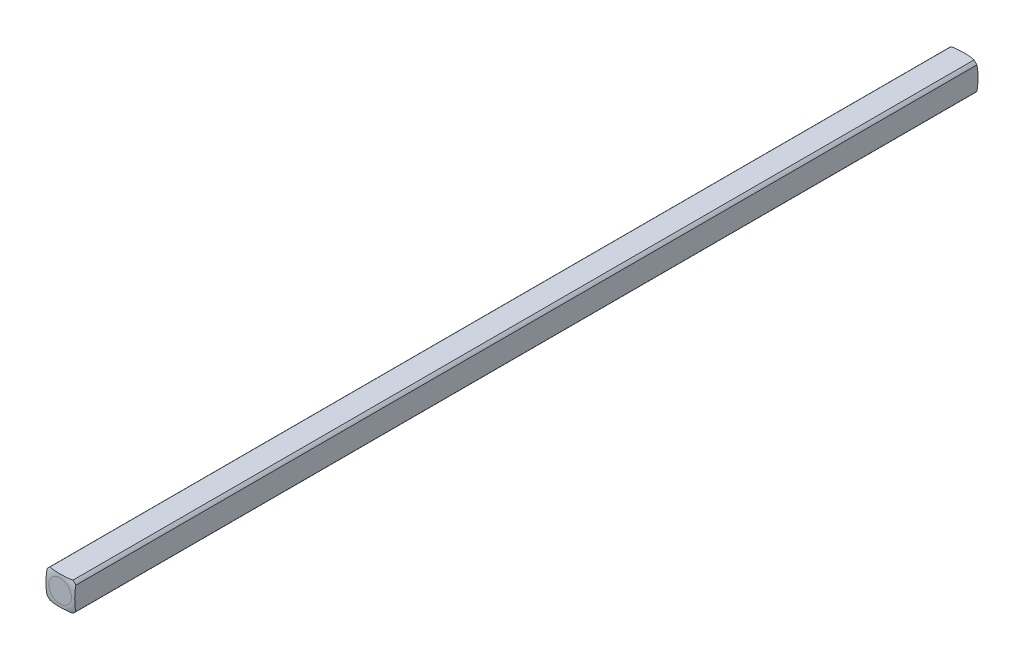
ISO-10303-21;
HEADER;
FILE_DESCRIPTION(('STEP AP214'),'2;1');
FILE_NAME('part.step','',(''),(''),'','','');
FILE_SCHEMA(('AUTOMOTIVE_DESIGN { 1 0 10303 214 1 1 1 1 }'));
ENDSEC;
DATA;
#1=APPLICATION_CONTEXT('core data for automotive mechanical design processes');
#2=APPLICATION_PROTOCOL_DEFINITION('international standard','automotive_design',2000,#1);
#3=PRODUCT_CONTEXT('',#1,'mechanical');
#4=PRODUCT('Part','Part','',(#3));
#5=PRODUCT_RELATED_PRODUCT_CATEGORY('part','',(#4));
#6=PRODUCT_DEFINITION_FORMATION('','',#4);
#7=PRODUCT_DEFINITION_CONTEXT('part definition',#1,'design');
#8=PRODUCT_DEFINITION('design','',#6,#7);
#9=PRODUCT_DEFINITION_SHAPE('','',#8);
#10=(LENGTH_UNIT() NAMED_UNIT(*) SI_UNIT(.MILLI.,.METRE.));
#11=(NAMED_UNIT(*) PLANE_ANGLE_UNIT() SI_UNIT($,.RADIAN.));
#12=(NAMED_UNIT(*) SI_UNIT($,.STERADIAN.) SOLID_ANGLE_UNIT());
#13=UNCERTAINTY_MEASURE_WITH_UNIT(LENGTH_MEASURE(1.E-05),#10,'distance_accuracy_value','');
#14=(GEOMETRIC_REPRESENTATION_CONTEXT(3) GLOBAL_UNCERTAINTY_ASSIGNED_CONTEXT((#13)) GLOBAL_UNIT_ASSIGNED_CONTEXT((#10,
#11,#12)) REPRESENTATION_CONTEXT('',''));
#15=CARTESIAN_POINT('',(0.,0.,0.));
#16=DIRECTION('',(0.,0.,1.));
#17=DIRECTION('',(1.,0.,0.));
#18=AXIS2_PLACEMENT_3D('',#15,#16,#17);
#19=CARTESIAN_POINT('',(-1.5875,-1.5875,49.911));
#20=DIRECTION('',(0.,1.,0.));
#21=DIRECTION('',(0.,0.,1.));
#22=AXIS2_PLACEMENT_3D('',#19,#20,#21);
#23=PLANE('',#22);
#24=CARTESIAN_POINT('',(1.26841150657032,-1.5875,-49.759919142098));
#25=CARTESIAN_POINT('',(1.22720105040827,-1.5875,-49.7701762604742));
#26=CARTESIAN_POINT('',(1.18578761357715,-1.5875,-49.7795927535058));
#27=CARTESIAN_POINT('',(1.10271120238514,-1.5875,-49.796861071626));
#28=CARTESIAN_POINT('',(1.06104879805324,-1.5875,-49.8047156312752));
#29=CARTESIAN_POINT('',(0.977511179219644,-1.5875,-49.8190074369776));
#30=CARTESIAN_POINT('',(0.935636116351978,-1.5875,-49.82544557827));
#31=CARTESIAN_POINT('',(0.85195632596747,-1.5875,-49.8370202217379));
#32=CARTESIAN_POINT('',(0.810152608329594,-1.5875,-49.8421640837943));
#33=CARTESIAN_POINT('',(0.726405135779092,-1.5875,-49.8513448983346));
#34=CARTESIAN_POINT('',(0.684461324130969,-1.5875,-49.8553813277516));
#35=CARTESIAN_POINT('',(0.600471089740472,-1.5875,-49.8624873965405));
#36=CARTESIAN_POINT('',(0.55842462478368,-1.5875,-49.8655565288188));
#37=CARTESIAN_POINT('',(0.442316252980614,-1.5875,-49.872876819996));
#38=CARTESIAN_POINT('',(0.368199297688235,-1.5875,-49.8762546095867));
#39=CARTESIAN_POINT('',(0.219899169562756,-1.5875,-49.8810241426145));
#40=CARTESIAN_POINT('',(0.145715990031034,-1.5875,-49.8824156550284));
#41=CARTESIAN_POINT('',(-0.00261925426802457,-1.5875,-49.8835115381934));
#42=CARTESIAN_POINT('',(-0.0767713119995583,-1.5875,-49.8832168909072));
#43=CARTESIAN_POINT('',(-0.225055834270109,-1.5875,-49.8808755268396));
#44=CARTESIAN_POINT('',(-0.299188296702211,-1.5875,-49.8788286662978));
#45=CARTESIAN_POINT('',(-0.448491393859349,-1.5875,-49.872519272075));
#46=CARTESIAN_POINT('',(-0.523660700911162,-1.5875,-49.8682235679572));
#47=CARTESIAN_POINT('',(-0.673772419103431,-1.5875,-49.8567011997426));
#48=CARTESIAN_POINT('',(-0.748714874122628,-1.5875,-49.8494751445196));
#49=CARTESIAN_POINT('',(-0.873294781040693,-1.5875,-49.8343054206116));
#50=CARTESIAN_POINT('',(-0.923058303404124,-1.5875,-49.8273998036191));
#51=CARTESIAN_POINT('',(-1.02230885751262,-1.5875,-49.8116736221696));
#52=CARTESIAN_POINT('',(-1.07179576173138,-1.5875,-49.8028522389467));
#53=CARTESIAN_POINT('',(-1.17042027552899,-1.5875,-49.7830571345187));
#54=CARTESIAN_POINT('',(-1.21955717475179,-1.58749999999998,-49.772079888906));
#55=CARTESIAN_POINT('',(-1.26841150657033,-1.58749999999996,-49.759919142098));
#56=B_SPLINE_CURVE_WITH_KNOTS('',3,(#24,#25,#26,#27,#28,#29,#30,#31,#32,#33,#34,#35,#36,#37,#38,
#39,#40,#41,#42,#43,#44,#45,#46,#47,#48,#49,#50,#51,#52,#53,#54,#55),.UNSPECIFIED.,.F.,.F.,(4,2,
2,2,2,2,2,2,2,2,2,2,2,2,2,4),(0.,0.127385669214949,0.254546315061895,0.381626357369329,
0.507966543484096,0.634366300757393,0.760832211740227,0.983375124489411,1.20594391900471,
1.42838311012148,1.65084055299026,1.87667574497213,2.10246403651328,2.25315484465145,
2.40391018266841,2.55491405868559),.UNSPECIFIED.);
#57=CARTESIAN_POINT('',(1.26841150657032,-1.5875,-49.759919142098));
#58=VERTEX_POINT('',#57);
#59=CARTESIAN_POINT('',(-1.26841150657032,-1.5875,-49.759919142098));
#60=VERTEX_POINT('',#59);
#61=EDGE_CURVE('E112',#58,#60,#56,.T.);
#62=ORIENTED_EDGE('',*,*,#61,.F.);
#63=DIRECTION('',(0.,0.,1.));
#64=VECTOR('',#63,1.);
#65=CARTESIAN_POINT('',(1.26841150657032,-1.5875,-49.911));
#66=LINE('',#65,#64);
#67=CARTESIAN_POINT('',(1.26841150657032,-1.5875,49.759919142098));
#68=VERTEX_POINT('',#67);
#69=EDGE_CURVE('E122',#68,#58,#66,.F.);
#70=ORIENTED_EDGE('',*,*,#69,.F.);
#71=CARTESIAN_POINT('',(-1.26841150657033,-1.5875,49.759919142098));
#72=CARTESIAN_POINT('',(-1.22720105040827,-1.5875,49.7701762604742));
#73=CARTESIAN_POINT('',(-1.18578761357715,-1.5875,49.7795927535058));
#74=CARTESIAN_POINT('',(-1.10271120238514,-1.5875,49.796861071626));
#75=CARTESIAN_POINT('',(-1.06104879805324,-1.5875,49.8047156312752));
#76=CARTESIAN_POINT('',(-0.97751117921964,-1.5875,49.8190074369776));
#77=CARTESIAN_POINT('',(-0.935636116351973,-1.5875,49.82544557827));
#78=CARTESIAN_POINT('',(-0.851956325967463,-1.5875,49.8370202217379));
#79=CARTESIAN_POINT('',(-0.810152608329586,-1.5875,49.8421640837943));
#80=CARTESIAN_POINT('',(-0.726405135779083,-1.5875,49.8513448983346));
#81=CARTESIAN_POINT('',(-0.684461324130958,-1.5875,49.8553813277516));
#82=CARTESIAN_POINT('',(-0.60047108974046,-1.5875,49.8624873965405));
#83=CARTESIAN_POINT('',(-0.558424624783667,-1.5875,49.8655565288188));
#84=CARTESIAN_POINT('',(-0.4423162529806,-1.5875,49.872876819996));
#85=CARTESIAN_POINT('',(-0.368199297688222,-1.5875,49.8762546095867));
#86=CARTESIAN_POINT('',(-0.219899169562744,-1.5875,49.8810241426145));
#87=CARTESIAN_POINT('',(-0.145715990031022,-1.5875,49.8824156550284));
#88=CARTESIAN_POINT('',(0.00261925426803486,-1.5875,49.8835115381934));
#89=CARTESIAN_POINT('',(0.076771311999568,-1.5875,49.8832168909072));
#90=CARTESIAN_POINT('',(0.225055834270118,-1.5875,49.8808755268396));
#91=CARTESIAN_POINT('',(0.299188296702219,-1.5875,49.8788286662978));
#92=CARTESIAN_POINT('',(0.448491393859357,-1.5875,49.872519272075));
#93=CARTESIAN_POINT('',(0.523660700911169,-1.5875,49.8682235679572));
#94=CARTESIAN_POINT('',(0.673772419103438,-1.5875,49.8567011997426));
#95=CARTESIAN_POINT('',(0.748714874122636,-1.5875,49.8494751445196));
#96=CARTESIAN_POINT('',(0.8732947810407,-1.5875,49.8343054206116));
#97=CARTESIAN_POINT('',(0.92305830340413,-1.5875,49.8273998036191));
#98=CARTESIAN_POINT('',(1.02230885751263,-1.5875,49.8116736221696));
#99=CARTESIAN_POINT('',(1.07179576173138,-1.5875,49.8028522389467));
#100=CARTESIAN_POINT('',(1.17042027552899,-1.5875,49.7830571345187));
#101=CARTESIAN_POINT('',(1.2195571747518,-1.58749999999998,49.772079888906));
#102=CARTESIAN_POINT('',(1.26841150657033,-1.58749999999996,49.759919142098));
#103=B_SPLINE_CURVE_WITH_KNOTS('',3,(#71,#72,#73,#74,#75,#76,#77,#78,#79,#80,#81,#82,#83,#84,
#85,#86,#87,#88,#89,#90,#91,#92,#93,#94,#95,#96,#97,#98,#99,#100,#101,#102),.UNSPECIFIED.,.F.,
.F.,(4,2,2,2,2,2,2,2,2,2,2,2,2,2,2,4),(0.,0.127385669214952,0.2545463150619,0.381626357369337,
0.507966543484107,0.634366300757407,0.760832211740243,0.983375124489425,1.20594391900472,
1.42838311012149,1.65084055299027,1.87667574497214,2.10246403651329,2.25315484465146,
2.40391018266842,2.55491405868559),.UNSPECIFIED.);
#104=CARTESIAN_POINT('',(-1.26841150657033,-1.5875,49.759919142098));
#105=VERTEX_POINT('',#104);
#106=EDGE_CURVE('E87',#105,#68,#103,.T.);
#107=ORIENTED_EDGE('',*,*,#106,.F.);
#108=DIRECTION('',(0.,0.,1.));
#109=VECTOR('',#108,1.);
#110=CARTESIAN_POINT('',(-1.26841150657032,-1.5875,-49.911));
#111=LINE('',#110,#109);
#112=EDGE_CURVE('E111',#60,#105,#111,.T.);
#113=ORIENTED_EDGE('',*,*,#112,.F.);
#114=EDGE_LOOP('',(#62,#70,#107,#113));
#115=FACE_BOUND('',#114,.T.);
#116=ADVANCED_FACE('F16',(#115),#23,.F.);
#117=CARTESIAN_POINT('',(0.,0.,-49.911));
#118=DIRECTION('',(0.,0.,1.));
#119=DIRECTION('',(1.,0.,0.));
#120=AXIS2_PLACEMENT_3D('',#117,#118,#119);
#121=CYLINDRICAL_SURFACE('',#120,2.032);
#122=CARTESIAN_POINT('',(0.,0.,49.759919142098));
#123=DIRECTION('',(0.,0.,1.));
#124=DIRECTION('',(1.,0.,0.));
#125=AXIS2_PLACEMENT_3D('',#122,#123,#124);
#126=CIRCLE('',#125,2.032);
#127=CARTESIAN_POINT('',(-1.5875,-1.26841150657032,49.759919142098));
#128=VERTEX_POINT('',#127);
#129=EDGE_CURVE('E96',#105,#128,#126,.F.);
#130=ORIENTED_EDGE('',*,*,#129,.T.);
#131=DIRECTION('',(0.,0.,-1.));
#132=VECTOR('',#131,1.);
#133=CARTESIAN_POINT('',(-1.5875,-1.26841150657032,49.911));
#134=LINE('',#133,#132);
#135=CARTESIAN_POINT('',(-1.5875,-1.26841150657032,-49.759919142098));
#136=VERTEX_POINT('',#135);
#137=EDGE_CURVE('E109',#128,#136,#134,.T.);
#138=ORIENTED_EDGE('',*,*,#137,.T.);
#139=CARTESIAN_POINT('',(0.,0.,-49.759919142098));
#140=DIRECTION('',(0.,0.,1.));
#141=DIRECTION('',(1.,0.,0.));
#142=AXIS2_PLACEMENT_3D('',#139,#140,#141);
#143=CIRCLE('',#142,2.032);
#144=EDGE_CURVE('E279',#60,#136,#143,.F.);
#145=ORIENTED_EDGE('',*,*,#144,.F.);
#146=ORIENTED_EDGE('',*,*,#112,.T.);
#147=EDGE_LOOP('',(#130,#138,#145,#146));
#148=FACE_BOUND('',#147,.T.);
#149=ADVANCED_FACE('F107',(#148),#121,.T.);
#150=CARTESIAN_POINT('',(0.,0.,-49.911));
#151=DIRECTION('',(0.,0.,1.));
#152=DIRECTION('',(1.,0.,0.));
#153=AXIS2_PLACEMENT_3D('',#150,#151,#152);
#154=CYLINDRICAL_SURFACE('',#153,2.032);
#155=CARTESIAN_POINT('',(0.,0.,49.759919142098));
#156=DIRECTION('',(0.,0.,1.));
#157=DIRECTION('',(1.,0.,0.));
#158=AXIS2_PLACEMENT_3D('',#155,#156,#157);
#159=CIRCLE('',#158,2.032);
#160=CARTESIAN_POINT('',(1.5875,-1.26841150657032,49.759919142098));
#161=VERTEX_POINT('',#160);
#162=EDGE_CURVE('E278',#161,#68,#159,.F.);
#163=ORIENTED_EDGE('',*,*,#162,.T.);
#164=ORIENTED_EDGE('',*,*,#69,.T.);
#165=CARTESIAN_POINT('',(0.,0.,-49.759919142098));
#166=DIRECTION('',(0.,0.,1.));
#167=DIRECTION('',(1.,0.,0.));
#168=AXIS2_PLACEMENT_3D('',#165,#166,#167);
#169=CIRCLE('',#168,2.032);
#170=CARTESIAN_POINT('',(1.5875,-1.26841150657032,-49.759919142098));
#171=VERTEX_POINT('',#170);
#172=EDGE_CURVE('E167',#58,#171,#169,.T.);
#173=ORIENTED_EDGE('',*,*,#172,.T.);
#174=DIRECTION('',(0.,0.,1.));
#175=VECTOR('',#174,1.);
#176=CARTESIAN_POINT('',(1.5875,-1.26841150657032,49.911));
#177=LINE('',#176,#175);
#178=EDGE_CURVE('E189',#171,#161,#177,.T.);
#179=ORIENTED_EDGE('',*,*,#178,.T.);
#180=EDGE_LOOP('',(#163,#164,#173,#179));
#181=FACE_BOUND('',#180,.T.);
#182=ADVANCED_FACE('F149',(#181),#154,.T.);
#183=CARTESIAN_POINT('',(-1.5875,1.5875,49.911));
#184=DIRECTION('',(0.,0.,-1.));
#185=DIRECTION('',(-1.,0.,0.));
#186=AXIS2_PLACEMENT_3D('',#183,#184,#185);
#187=PLANE('',#186);
#188=CARTESIAN_POINT('',(0.,0.,49.911));
#189=DIRECTION('',(0.,0.,-1.));
#190=DIRECTION('',(1.,0.,0.));
#191=AXIS2_PLACEMENT_3D('',#188,#189,#190);
#192=CIRCLE('',#191,1.24506403026729);
#193=CARTESIAN_POINT('',(1.24506403026729,0.,49.911));
#194=VERTEX_POINT('',#193);
#195=CARTESIAN_POINT('',(-1.24506403026729,0.,49.911));
#196=VERTEX_POINT('',#195);
#197=EDGE_CURVE('E117',#194,#196,#192,.T.);
#198=ORIENTED_EDGE('',*,*,#197,.F.);
#199=CARTESIAN_POINT('',(0.,0.,49.911));
#200=DIRECTION('',(0.,0.,-1.));
#201=DIRECTION('',(-1.,0.,0.));
#202=AXIS2_PLACEMENT_3D('',#199,#200,#201);
#203=CIRCLE('',#202,1.24506403026729);
#204=EDGE_CURVE('E163',#196,#194,#203,.T.);
#205=ORIENTED_EDGE('',*,*,#204,.F.);
#206=EDGE_LOOP('',(#198,#205));
#207=FACE_BOUND('',#206,.T.);
#208=ADVANCED_FACE('F139',(#207),#187,.F.);
#209=CARTESIAN_POINT('',(-1.5875,-1.5875,49.911));
#210=DIRECTION('',(1.,0.,0.));
#211=DIRECTION('',(0.,0.,-1.));
#212=AXIS2_PLACEMENT_3D('',#209,#210,#211);
#213=PLANE('',#212);
#214=CARTESIAN_POINT('',(-1.5875,-1.26841150657033,-49.759919142098));
#215=CARTESIAN_POINT('',(-1.5875,-1.1449330903041,-49.7906460633221));
#216=CARTESIAN_POINT('',(-1.5875,-1.01998399304383,-49.8137556661494));
#217=CARTESIAN_POINT('',(-1.5875,-0.768859486803924,-49.8485369425311));
#218=CARTESIAN_POINT('',(-1.5875,-0.642689416140629,-49.860245727962));
#219=CARTESIAN_POINT('',(-1.5875,-0.430424575859621,-49.8736252995166));
#220=CARTESIAN_POINT('',(-1.5875,-0.344419790998912,-49.8773089066951));
#221=CARTESIAN_POINT('',(-1.5875,-0.172275750609257,-49.8821119883047));
#222=CARTESIAN_POINT('',(-1.5875,-0.0861364440860028,-49.8832298028463));
#223=CARTESIAN_POINT('',(-1.5875,0.0708815141524196,-49.8832253528724));
#224=CARTESIAN_POINT('',(-1.5875,0.141761089973269,-49.8824647503116));
#225=CARTESIAN_POINT('',(-1.5875,0.283443517066233,-49.8792632283593));
#226=CARTESIAN_POINT('',(-1.5875,0.354246388904852,-49.8768233071219));
#227=CARTESIAN_POINT('',(-1.5875,0.495806846039993,-49.8698353290476));
#228=CARTESIAN_POINT('',(-1.5875,0.566564357181162,-49.8652856874328));
#229=CARTESIAN_POINT('',(-1.5875,0.707839358368325,-49.8534687398624));
#230=CARTESIAN_POINT('',(-1.5875,0.778356910390611,-49.8462021995255));
#231=CARTESIAN_POINT('',(-1.5875,0.919223859265381,-49.8282291029893));
#232=CARTESIAN_POINT('',(-1.5875,0.989571770847697,-49.8175104282261));
#233=CARTESIAN_POINT('',(-1.5875,1.12959917493506,-49.7919650360794));
#234=CARTESIAN_POINT('',(-1.5875,1.19927774910522,-49.7771333317905));
#235=CARTESIAN_POINT('',(-1.5875,1.26841150657032,-49.759919142098));
#236=B_SPLINE_CURVE_WITH_KNOTS('',3,(#214,#215,#216,#217,#218,#219,#220,#221,#222,#223,#224,
#225,#226,#227,#228,#229,#230,#231,#232,#233,#234,#235),.UNSPECIFIED.,.F.,.F.,(4,2,2,2,2,2,2,2,
2,2,4),(0.,0.380919121752896,0.760594090647793,1.01882661939087,1.27722615960104,
1.48986264420096,1.70237285085079,1.91504294996344,2.12765316402353,2.34101802413352,
2.55464272138866),.UNSPECIFIED.);
#237=CARTESIAN_POINT('',(-1.5875,1.26841150657032,-49.759919142098));
#238=VERTEX_POINT('',#237);
#239=EDGE_CURVE('E115',#136,#238,#236,.T.);
#240=ORIENTED_EDGE('',*,*,#239,.F.);
#241=ORIENTED_EDGE('',*,*,#137,.F.);
#242=CARTESIAN_POINT('',(-1.5875,1.26841150657033,49.759919142098));
#243=CARTESIAN_POINT('',(-1.5875,1.1449330903041,49.7906460633221));
#244=CARTESIAN_POINT('',(-1.5875,1.01998399304383,49.8137556661494));
#245=CARTESIAN_POINT('',(-1.5875,0.768859486803924,49.8485369425311));
#246=CARTESIAN_POINT('',(-1.5875,0.642689416140629,49.860245727962));
#247=CARTESIAN_POINT('',(-1.5875,0.430424575859621,49.8736252995166));
#248=CARTESIAN_POINT('',(-1.5875,0.344419790998912,49.8773089066951));
#249=CARTESIAN_POINT('',(-1.5875,0.172275750609257,49.8821119883047));
#250=CARTESIAN_POINT('',(-1.5875,0.0861364440860028,49.8832298028463));
#251=CARTESIAN_POINT('',(-1.5875,-0.0708815141524196,49.8832253528724));
#252=CARTESIAN_POINT('',(-1.5875,-0.141761089973269,49.8824647503116));
#253=CARTESIAN_POINT('',(-1.5875,-0.283443517066233,49.8792632283593));
#254=CARTESIAN_POINT('',(-1.5875,-0.354246388904852,49.8768233071219));
#255=CARTESIAN_POINT('',(-1.5875,-0.495806846039993,49.8698353290476));
#256=CARTESIAN_POINT('',(-1.5875,-0.566564357181162,49.8652856874328));
#257=CARTESIAN_POINT('',(-1.5875,-0.707839358368325,49.8534687398624));
#258=CARTESIAN_POINT('',(-1.5875,-0.778356910390611,49.8462021995255));
#259=CARTESIAN_POINT('',(-1.5875,-0.919223859265381,49.8282291029893));
#260=CARTESIAN_POINT('',(-1.5875,-0.989571770847697,49.8175104282261));
#261=CARTESIAN_POINT('',(-1.5875,-1.12959917493506,49.7919650360794));
#262=CARTESIAN_POINT('',(-1.5875,-1.19927774910522,49.7771333317905));
#263=CARTESIAN_POINT('',(-1.5875,-1.26841150657032,49.759919142098));
#264=B_SPLINE_CURVE_WITH_KNOTS('',3,(#242,#243,#244,#245,#246,#247,#248,#249,#250,#251,#252,
#253,#254,#255,#256,#257,#258,#259,#260,#261,#262,#263),.UNSPECIFIED.,.F.,.F.,(4,2,2,2,2,2,2,2,
2,2,4),(0.,0.380919121752896,0.760594090647793,1.01882661939087,1.27722615960104,
1.48986264420096,1.70237285085079,1.91504294996344,2.12765316402353,2.34101802413352,
2.55464272138866),.UNSPECIFIED.);
#265=CARTESIAN_POINT('',(-1.5875,1.26841150657032,49.759919142098));
#266=VERTEX_POINT('',#265);
#267=EDGE_CURVE('E92',#266,#128,#264,.T.);
#268=ORIENTED_EDGE('',*,*,#267,.F.);
#269=DIRECTION('',(0.,0.,1.));
#270=VECTOR('',#269,1.);
#271=CARTESIAN_POINT('',(-1.5875,1.26841150657032,-49.911));
#272=LINE('',#271,#270);
#273=EDGE_CURVE('E102',#238,#266,#272,.T.);
#274=ORIENTED_EDGE('',*,*,#273,.F.);
#275=EDGE_LOOP('',(#240,#241,#268,#274));
#276=FACE_BOUND('',#275,.T.);
#277=ADVANCED_FACE('F114',(#276),#213,.F.);
#278=CARTESIAN_POINT('',(-1.5875,1.5875,-49.911));
#279=DIRECTION('',(0.,0.,-1.));
#280=DIRECTION('',(-1.,0.,0.));
#281=AXIS2_PLACEMENT_3D('',#278,#279,#280);
#282=PLANE('',#281);
#283=CARTESIAN_POINT('',(0.,0.,-49.911));
#284=DIRECTION('',(0.,0.,1.));
#285=DIRECTION('',(1.,0.,0.));
#286=AXIS2_PLACEMENT_3D('',#283,#284,#285);
#287=CIRCLE('',#286,1.24506403026729);
#288=CARTESIAN_POINT('',(1.24506403026729,0.,-49.911));
#289=VERTEX_POINT('',#288);
#290=CARTESIAN_POINT('',(-1.24506403026729,0.,-49.911));
#291=VERTEX_POINT('',#290);
#292=EDGE_CURVE('E202',#289,#291,#287,.T.);
#293=ORIENTED_EDGE('',*,*,#292,.F.);
#294=CARTESIAN_POINT('',(0.,0.,-49.911));
#295=DIRECTION('',(0.,0.,1.));
#296=DIRECTION('',(-1.,0.,0.));
#297=AXIS2_PLACEMENT_3D('',#294,#295,#296);
#298=CIRCLE('',#297,1.24506403026729);
#299=EDGE_CURVE('E119',#289,#291,#298,.F.);
#300=ORIENTED_EDGE('',*,*,#299,.T.);
#301=EDGE_LOOP('',(#293,#300));
#302=FACE_BOUND('',#301,.T.);
#303=ADVANCED_FACE('F207',(#302),#282,.T.);
#304=CARTESIAN_POINT('',(1.5875,-1.5875,49.911));
#305=DIRECTION('',(-1.,0.,0.));
#306=DIRECTION('',(0.,0.,1.));
#307=AXIS2_PLACEMENT_3D('',#304,#305,#306);
#308=PLANE('',#307);
#309=ORIENTED_EDGE('',*,*,#178,.F.);
#310=CARTESIAN_POINT('',(1.5875,1.26841150657032,-49.759919142098));
#311=CARTESIAN_POINT('',(1.5875,1.1449330903041,-49.7906460633221));
#312=CARTESIAN_POINT('',(1.5875,1.01998399304383,-49.8137556661494));
#313=CARTESIAN_POINT('',(1.5875,0.768859486803922,-49.8485369425311));
#314=CARTESIAN_POINT('',(1.5875,0.642689416140627,-49.860245727962));
#315=CARTESIAN_POINT('',(1.5875,0.430424575859619,-49.8736252995166));
#316=CARTESIAN_POINT('',(1.5875,0.344419790998911,-49.8773089066951));
#317=CARTESIAN_POINT('',(1.5875,0.172275750609256,-49.8821119883047));
#318=CARTESIAN_POINT('',(1.5875,0.0861364440860028,-49.8832298028463));
#319=CARTESIAN_POINT('',(1.5875,-0.0708815141524195,-49.8832253528724));
#320=CARTESIAN_POINT('',(1.5875,-0.141761089973269,-49.8824647503116));
#321=CARTESIAN_POINT('',(1.5875,-0.283443517066232,-49.8792632283593));
#322=CARTESIAN_POINT('',(1.5875,-0.354246388904852,-49.8768233071219));
#323=CARTESIAN_POINT('',(1.5875,-0.495806846039993,-49.8698353290476));
#324=CARTESIAN_POINT('',(1.5875,-0.566564357181162,-49.8652856874328));
#325=CARTESIAN_POINT('',(1.5875,-0.707839358368325,-49.8534687398624));
#326=CARTESIAN_POINT('',(1.5875,-0.778356910390611,-49.8462021995255));
#327=CARTESIAN_POINT('',(1.5875,-0.919223859265382,-49.8282291029893));
#328=CARTESIAN_POINT('',(1.5875,-0.989571770847698,-49.8175104282261));
#329=CARTESIAN_POINT('',(1.5875,-1.12959917493506,-49.7919650360794));
#330=CARTESIAN_POINT('',(1.5875,-1.19927774910522,-49.7771333317905));
#331=CARTESIAN_POINT('',(1.5875,-1.26841150657033,-49.759919142098));
#332=B_SPLINE_CURVE_WITH_KNOTS('',3,(#310,#311,#312,#313,#314,#315,#316,#317,#318,#319,#320,
#321,#322,#323,#324,#325,#326,#327,#328,#329,#330,#331),.UNSPECIFIED.,.F.,.F.,(4,2,2,2,2,2,2,2,
2,2,4),(0.,0.380919121752896,0.760594090647793,1.01882661939087,1.27722615960104,
1.48986264420096,1.70237285085079,1.91504294996344,2.12765316402353,2.34101802413352,
2.55464272138867),.UNSPECIFIED.);
#333=CARTESIAN_POINT('',(1.5875,1.26841150657032,-49.759919142098));
#334=VERTEX_POINT('',#333);
#335=EDGE_CURVE('E230',#334,#171,#332,.T.);
#336=ORIENTED_EDGE('',*,*,#335,.F.);
#337=DIRECTION('',(0.,0.,1.));
#338=VECTOR('',#337,1.);
#339=CARTESIAN_POINT('',(1.5875,1.26841150657032,-49.911));
#340=LINE('',#339,#338);
#341=CARTESIAN_POINT('',(1.5875,1.26841150657032,49.759919142098));
#342=VERTEX_POINT('',#341);
#343=EDGE_CURVE('E192',#342,#334,#340,.F.);
#344=ORIENTED_EDGE('',*,*,#343,.F.);
#345=CARTESIAN_POINT('',(1.5875,-1.26841150657032,49.759919142098));
#346=CARTESIAN_POINT('',(1.5875,-1.1449330903041,49.7906460633221));
#347=CARTESIAN_POINT('',(1.5875,-1.01998399304383,49.8137556661494));
#348=CARTESIAN_POINT('',(1.5875,-0.768859486803923,49.8485369425311));
#349=CARTESIAN_POINT('',(1.5875,-0.642689416140627,49.860245727962));
#350=CARTESIAN_POINT('',(1.5875,-0.43042457585962,49.8736252995166));
#351=CARTESIAN_POINT('',(1.5875,-0.344419790998911,49.8773089066951));
#352=CARTESIAN_POINT('',(1.5875,-0.172275750609256,49.8821119883047));
#353=CARTESIAN_POINT('',(1.5875,-0.0861364440860027,49.8832298028463));
#354=CARTESIAN_POINT('',(1.5875,0.0708815141524194,49.8832253528724));
#355=CARTESIAN_POINT('',(1.5875,0.141761089973268,49.8824647503116));
#356=CARTESIAN_POINT('',(1.5875,0.283443517066233,49.8792632283593));
#357=CARTESIAN_POINT('',(1.5875,0.354246388904852,49.8768233071219));
#358=CARTESIAN_POINT('',(1.5875,0.495806846039993,49.8698353290476));
#359=CARTESIAN_POINT('',(1.5875,0.566564357181161,49.8652856874328));
#360=CARTESIAN_POINT('',(1.5875,0.707839358368325,49.8534687398624));
#361=CARTESIAN_POINT('',(1.5875,0.778356910390611,49.8462021995255));
#362=CARTESIAN_POINT('',(1.5875,0.919223859265381,49.8282291029893));
#363=CARTESIAN_POINT('',(1.5875,0.989571770847698,49.8175104282261));
#364=CARTESIAN_POINT('',(1.5875,1.12959917493506,49.7919650360794));
#365=CARTESIAN_POINT('',(1.5875,1.19927774910522,49.7771333317905));
#366=CARTESIAN_POINT('',(1.5875,1.26841150657033,49.759919142098));
#367=B_SPLINE_CURVE_WITH_KNOTS('',3,(#345,#346,#347,#348,#349,#350,#351,#352,#353,#354,#355,
#356,#357,#358,#359,#360,#361,#362,#363,#364,#365,#366),.UNSPECIFIED.,.F.,.F.,(4,2,2,2,2,2,2,2,
2,2,4),(0.,0.380919121752896,0.760594090647793,1.01882661939087,1.27722615960104,
1.48986264420096,1.70237285085079,1.91504294996344,2.12765316402353,2.34101802413352,
2.55464272138867),.UNSPECIFIED.);
#368=EDGE_CURVE('E103',#161,#342,#367,.T.);
#369=ORIENTED_EDGE('',*,*,#368,.F.);
#370=EDGE_LOOP('',(#309,#336,#344,#369));
#371=FACE_BOUND('',#370,.T.);
#372=ADVANCED_FACE('F180',(#371),#308,.F.);
#373=CARTESIAN_POINT('',(1.24506403026729,0.,47.786));
#374=DIRECTION('',(0.,-1.,0.));
#375=DIRECTION('',(1.,0.,0.));
#376=AXIS2_PLACEMENT_3D('',#373,#374,#375);
#377=CIRCLE('',#376,2.125);
#378=TRIMMED_CURVE('',#377,(PARAMETER_VALUE(-2.19680193092879)),
(PARAMETER_VALUE(2.19680193092879)),.T.,.PARAMETER.);
#379=CARTESIAN_POINT('',(0.,0.,47.786));
#380=DIRECTION('',(0.,0.,-1.));
#381=AXIS1_PLACEMENT('',#379,#380);
#382=SURFACE_OF_REVOLUTION('',#378,#381);
#383=ORIENTED_EDGE('',*,*,#267,.T.);
#384=ORIENTED_EDGE('',*,*,#129,.F.);
#385=ORIENTED_EDGE('',*,*,#106,.T.);
#386=ORIENTED_EDGE('',*,*,#162,.F.);
#387=ORIENTED_EDGE('',*,*,#368,.T.);
#388=CARTESIAN_POINT('',(0.,0.,49.759919142098));
#389=DIRECTION('',(0.,0.,1.));
#390=DIRECTION('',(1.,0.,0.));
#391=AXIS2_PLACEMENT_3D('',#388,#389,#390);
#392=CIRCLE('',#391,2.032);
#393=CARTESIAN_POINT('',(1.26841150657032,1.5875,49.759919142098));
#394=VERTEX_POINT('',#393);
#395=EDGE_CURVE('E195',#394,#342,#392,.F.);
#396=ORIENTED_EDGE('',*,*,#395,.F.);
#397=CARTESIAN_POINT('',(1.26841150657032,1.5875,49.759919142098));
#398=CARTESIAN_POINT('',(1.22720105040827,1.5875,49.7701762604742));
#399=CARTESIAN_POINT('',(1.18578761357715,1.5875,49.7795927535058));
#400=CARTESIAN_POINT('',(1.10271120238514,1.5875,49.796861071626));
#401=CARTESIAN_POINT('',(1.06104879805324,1.5875,49.8047156312752));
#402=CARTESIAN_POINT('',(0.977511179219644,1.5875,49.8190074369776));
#403=CARTESIAN_POINT('',(0.935636116351978,1.5875,49.82544557827));
#404=CARTESIAN_POINT('',(0.85195632596747,1.5875,49.8370202217379));
#405=CARTESIAN_POINT('',(0.810152608329594,1.5875,49.8421640837943));
#406=CARTESIAN_POINT('',(0.726405135779092,1.5875,49.8513448983346));
#407=CARTESIAN_POINT('',(0.684461324130969,1.5875,49.8553813277516));
#408=CARTESIAN_POINT('',(0.600471089740472,1.5875,49.8624873965405));
#409=CARTESIAN_POINT('',(0.55842462478368,1.5875,49.8655565288188));
#410=CARTESIAN_POINT('',(0.442316252980614,1.5875,49.872876819996));
#411=CARTESIAN_POINT('',(0.368199297688235,1.5875,49.8762546095867));
#412=CARTESIAN_POINT('',(0.219899169562756,1.5875,49.8810241426145));
#413=CARTESIAN_POINT('',(0.145715990031034,1.5875,49.8824156550284));
#414=CARTESIAN_POINT('',(-0.00261925426802457,1.5875,49.8835115381934));
#415=CARTESIAN_POINT('',(-0.0767713119995583,1.5875,49.8832168909072));
#416=CARTESIAN_POINT('',(-0.225055834270109,1.5875,49.8808755268396));
#417=CARTESIAN_POINT('',(-0.299188296702211,1.5875,49.8788286662978));
#418=CARTESIAN_POINT('',(-0.448491393859349,1.5875,49.872519272075));
#419=CARTESIAN_POINT('',(-0.523660700911162,1.5875,49.8682235679572));
#420=CARTESIAN_POINT('',(-0.673772419103431,1.5875,49.8567011997426));
#421=CARTESIAN_POINT('',(-0.748714874122628,1.5875,49.8494751445196));
#422=CARTESIAN_POINT('',(-0.873294781040693,1.5875,49.8343054206116));
#423=CARTESIAN_POINT('',(-0.923058303404124,1.5875,49.8273998036191));
#424=CARTESIAN_POINT('',(-1.02230885751262,1.5875,49.8116736221696));
#425=CARTESIAN_POINT('',(-1.07179576173138,1.5875,49.8028522389467));
#426=CARTESIAN_POINT('',(-1.17042027552899,1.5875,49.7830571345187));
#427=CARTESIAN_POINT('',(-1.21955717475179,1.58749999999998,49.772079888906));
#428=CARTESIAN_POINT('',(-1.26841150657033,1.58749999999996,49.759919142098));
#429=B_SPLINE_CURVE_WITH_KNOTS('',3,(#397,#398,#399,#400,#401,#402,#403,#404,#405,#406,#407,
#408,#409,#410,#411,#412,#413,#414,#415,#416,#417,#418,#419,#420,#421,#422,#423,#424,#425,#426,
#427,#428),.UNSPECIFIED.,.F.,.F.,(4,2,2,2,2,2,2,2,2,2,2,2,2,2,2,4),(0.,0.127385669214949,
0.254546315061895,0.381626357369329,0.507966543484096,0.634366300757393,0.760832211740227,
0.983375124489411,1.20594391900471,1.42838311012148,1.65084055299026,1.87667574497213,
2.10246403651328,2.25315484465145,2.40391018266841,2.55491405868559),.UNSPECIFIED.);
#430=CARTESIAN_POINT('',(-1.26841150657032,1.5875,49.759919142098));
#431=VERTEX_POINT('',#430);
#432=EDGE_CURVE('E194',#394,#431,#429,.T.);
#433=ORIENTED_EDGE('',*,*,#432,.T.);
#434=CARTESIAN_POINT('',(0.,0.,49.759919142098));
#435=DIRECTION('',(0.,0.,1.));
#436=DIRECTION('',(1.,0.,0.));
#437=AXIS2_PLACEMENT_3D('',#434,#435,#436);
#438=CIRCLE('',#437,2.032);
#439=EDGE_CURVE('E98',#266,#431,#438,.F.);
#440=ORIENTED_EDGE('',*,*,#439,.F.);
#441=EDGE_LOOP('',(#383,#384,#385,#386,#387,#396,#433,#440));
#442=FACE_BOUND('',#441,.T.);
#443=ORIENTED_EDGE('',*,*,#197,.T.);
#444=ORIENTED_EDGE('',*,*,#204,.T.);
#445=EDGE_LOOP('',(#443,#444));
#446=FACE_BOUND('',#445,.T.);
#447=ADVANCED_FACE('F94',(#442,#446),#382,.F.);
#448=CARTESIAN_POINT('',(0.,0.,-49.911));
#449=DIRECTION('',(0.,0.,1.));
#450=DIRECTION('',(1.,0.,0.));
#451=AXIS2_PLACEMENT_3D('',#448,#449,#450);
#452=CYLINDRICAL_SURFACE('',#451,2.032);
#453=ORIENTED_EDGE('',*,*,#439,.T.);
#454=DIRECTION('',(0.,0.,-1.));
#455=VECTOR('',#454,1.);
#456=CARTESIAN_POINT('',(-1.26841150657032,1.5875,49.911));
#457=LINE('',#456,#455);
#458=CARTESIAN_POINT('',(-1.26841150657032,1.5875,-49.759919142098));
#459=VERTEX_POINT('',#458);
#460=EDGE_CURVE('E235',#431,#459,#457,.T.);
#461=ORIENTED_EDGE('',*,*,#460,.T.);
#462=CARTESIAN_POINT('',(0.,0.,-49.759919142098));
#463=DIRECTION('',(0.,0.,1.));
#464=DIRECTION('',(1.,0.,0.));
#465=AXIS2_PLACEMENT_3D('',#462,#463,#464);
#466=CIRCLE('',#465,2.032);
#467=EDGE_CURVE('E229',#238,#459,#466,.F.);
#468=ORIENTED_EDGE('',*,*,#467,.F.);
#469=ORIENTED_EDGE('',*,*,#273,.T.);
#470=EDGE_LOOP('',(#453,#461,#468,#469));
#471=FACE_BOUND('',#470,.T.);
#472=ADVANCED_FACE('F179',(#471),#452,.T.);
#473=CARTESIAN_POINT('',(1.24506403026729,0.,-47.786));
#474=DIRECTION('',(0.,1.,0.));
#475=DIRECTION('',(1.,0.,0.));
#476=AXIS2_PLACEMENT_3D('',#473,#474,#475);
#477=CIRCLE('',#476,2.125);
#478=TRIMMED_CURVE('',#477,(PARAMETER_VALUE(-2.19680193092879)),
(PARAMETER_VALUE(2.19680193092879)),.T.,.PARAMETER.);
#479=CARTESIAN_POINT('',(0.,0.,-47.786));
#480=DIRECTION('',(0.,0.,1.));
#481=AXIS1_PLACEMENT('',#479,#480);
#482=SURFACE_OF_REVOLUTION('',#478,#481);
#483=ORIENTED_EDGE('',*,*,#292,.T.);
#484=ORIENTED_EDGE('',*,*,#299,.F.);
#485=EDGE_LOOP('',(#483,#484));
#486=FACE_BOUND('',#485,.T.);
#487=ORIENTED_EDGE('',*,*,#335,.T.);
#488=ORIENTED_EDGE('',*,*,#172,.F.);
#489=ORIENTED_EDGE('',*,*,#61,.T.);
#490=ORIENTED_EDGE('',*,*,#144,.T.);
#491=ORIENTED_EDGE('',*,*,#239,.T.);
#492=ORIENTED_EDGE('',*,*,#467,.T.);
#493=CARTESIAN_POINT('',(-1.26841150657033,1.5875,-49.759919142098));
#494=CARTESIAN_POINT('',(-1.22720105040827,1.5875,-49.7701762604742));
#495=CARTESIAN_POINT('',(-1.18578761357715,1.5875,-49.7795927535058));
#496=CARTESIAN_POINT('',(-1.10271120238514,1.5875,-49.796861071626));
#497=CARTESIAN_POINT('',(-1.06104879805324,1.5875,-49.8047156312752));
#498=CARTESIAN_POINT('',(-0.97751117921964,1.5875,-49.8190074369776));
#499=CARTESIAN_POINT('',(-0.935636116351972,1.5875,-49.82544557827));
#500=CARTESIAN_POINT('',(-0.851956325967463,1.5875,-49.8370202217379));
#501=CARTESIAN_POINT('',(-0.810152608329585,1.5875,-49.8421640837943));
#502=CARTESIAN_POINT('',(-0.726405135779082,1.5875,-49.8513448983346));
#503=CARTESIAN_POINT('',(-0.684461324130958,1.5875,-49.8553813277516));
#504=CARTESIAN_POINT('',(-0.600471089740459,1.5875,-49.8624873965405));
#505=CARTESIAN_POINT('',(-0.558424624783666,1.5875,-49.8655565288188));
#506=CARTESIAN_POINT('',(-0.4423162529806,1.5875,-49.872876819996));
#507=CARTESIAN_POINT('',(-0.368199297688221,1.5875,-49.8762546095867));
#508=CARTESIAN_POINT('',(-0.219899169562744,1.5875,-49.8810241426145));
#509=CARTESIAN_POINT('',(-0.145715990031022,1.5875,-49.8824156550284));
#510=CARTESIAN_POINT('',(0.00261925426803493,1.5875,-49.8835115381934));
#511=CARTESIAN_POINT('',(0.0767713119995681,1.5875,-49.8832168909072));
#512=CARTESIAN_POINT('',(0.225055834270118,1.5875,-49.8808755268396));
#513=CARTESIAN_POINT('',(0.299188296702219,1.5875,-49.8788286662978));
#514=CARTESIAN_POINT('',(0.448491393859357,1.5875,-49.872519272075));
#515=CARTESIAN_POINT('',(0.523660700911169,1.5875,-49.8682235679572));
#516=CARTESIAN_POINT('',(0.673772419103438,1.5875,-49.8567011997426));
#517=CARTESIAN_POINT('',(0.748714874122635,1.5875,-49.8494751445196));
#518=CARTESIAN_POINT('',(0.873294781040699,1.5875,-49.8343054206116));
#519=CARTESIAN_POINT('',(0.92305830340413,1.5875,-49.8273998036191));
#520=CARTESIAN_POINT('',(1.02230885751263,1.5875,-49.8116736221696));
#521=CARTESIAN_POINT('',(1.07179576173138,1.5875,-49.8028522389467));
#522=CARTESIAN_POINT('',(1.17042027552899,1.5875,-49.7830571345187));
#523=CARTESIAN_POINT('',(1.2195571747518,1.58749999999998,-49.772079888906));
#524=CARTESIAN_POINT('',(1.26841150657033,1.58749999999996,-49.759919142098));
#525=B_SPLINE_CURVE_WITH_KNOTS('',3,(#493,#494,#495,#496,#497,#498,#499,#500,#501,#502,#503,
#504,#505,#506,#507,#508,#509,#510,#511,#512,#513,#514,#515,#516,#517,#518,#519,#520,#521,#522,
#523,#524),.UNSPECIFIED.,.F.,.F.,(4,2,2,2,2,2,2,2,2,2,2,2,2,2,2,4),(0.,0.127385669214952,
0.2545463150619,0.381626357369337,0.507966543484107,0.634366300757407,0.760832211740243,
0.983375124489425,1.20594391900472,1.42838311012149,1.65084055299027,1.87667574497214,
2.10246403651328,2.25315484465146,2.40391018266842,2.55491405868559),.UNSPECIFIED.);
#526=CARTESIAN_POINT('',(1.26841150657032,1.5875,-49.759919142098));
#527=VERTEX_POINT('',#526);
#528=EDGE_CURVE('E28',#459,#527,#525,.T.);
#529=ORIENTED_EDGE('',*,*,#528,.T.);
#530=CARTESIAN_POINT('',(0.,0.,-49.759919142098));
#531=DIRECTION('',(0.,0.,1.));
#532=DIRECTION('',(1.,0.,0.));
#533=AXIS2_PLACEMENT_3D('',#530,#531,#532);
#534=CIRCLE('',#533,2.032);
#535=EDGE_CURVE('E36',#334,#527,#534,.T.);
#536=ORIENTED_EDGE('',*,*,#535,.F.);
#537=EDGE_LOOP('',(#487,#488,#489,#490,#491,#492,#529,#536));
#538=FACE_BOUND('',#537,.T.);
#539=ADVANCED_FACE('F225',(#486,#538),#482,.F.);
#540=CARTESIAN_POINT('',(0.,0.,-49.911));
#541=DIRECTION('',(0.,0.,1.));
#542=DIRECTION('',(1.,0.,0.));
#543=AXIS2_PLACEMENT_3D('',#540,#541,#542);
#544=CYLINDRICAL_SURFACE('',#543,2.032);
#545=ORIENTED_EDGE('',*,*,#395,.T.);
#546=ORIENTED_EDGE('',*,*,#343,.T.);
#547=ORIENTED_EDGE('',*,*,#535,.T.);
#548=DIRECTION('',(0.,0.,-1.));
#549=VECTOR('',#548,1.);
#550=CARTESIAN_POINT('',(1.26841150657032,1.5875,49.911));
#551=LINE('',#550,#549);
#552=EDGE_CURVE('E11',#527,#394,#551,.F.);
#553=ORIENTED_EDGE('',*,*,#552,.T.);
#554=EDGE_LOOP('',(#545,#546,#547,#553));
#555=FACE_BOUND('',#554,.T.);
#556=ADVANCED_FACE('F259',(#555),#544,.T.);
#557=CARTESIAN_POINT('',(-1.5875,1.5875,49.911));
#558=DIRECTION('',(0.,-1.,0.));
#559=DIRECTION('',(0.,0.,-1.));
#560=AXIS2_PLACEMENT_3D('',#557,#558,#559);
#561=PLANE('',#560);
#562=ORIENTED_EDGE('',*,*,#528,.F.);
#563=ORIENTED_EDGE('',*,*,#460,.F.);
#564=ORIENTED_EDGE('',*,*,#432,.F.);
#565=ORIENTED_EDGE('',*,*,#552,.F.);
#566=EDGE_LOOP('',(#562,#563,#564,#565));
#567=FACE_BOUND('',#566,.T.);
#568=ADVANCED_FACE('F238',(#567),#561,.F.);
#569=CLOSED_SHELL('',(#116,#149,#182,#208,#277,#303,#372,#447,#472,#539,#556,#568));
#570=MANIFOLD_SOLID_BREP('B1',#569);
#571=ADVANCED_BREP_SHAPE_REPRESENTATION('',(#18,#570),#14);
#572=SHAPE_DEFINITION_REPRESENTATION(#9,#571);
ENDSEC;
END-ISO-10303-21;
